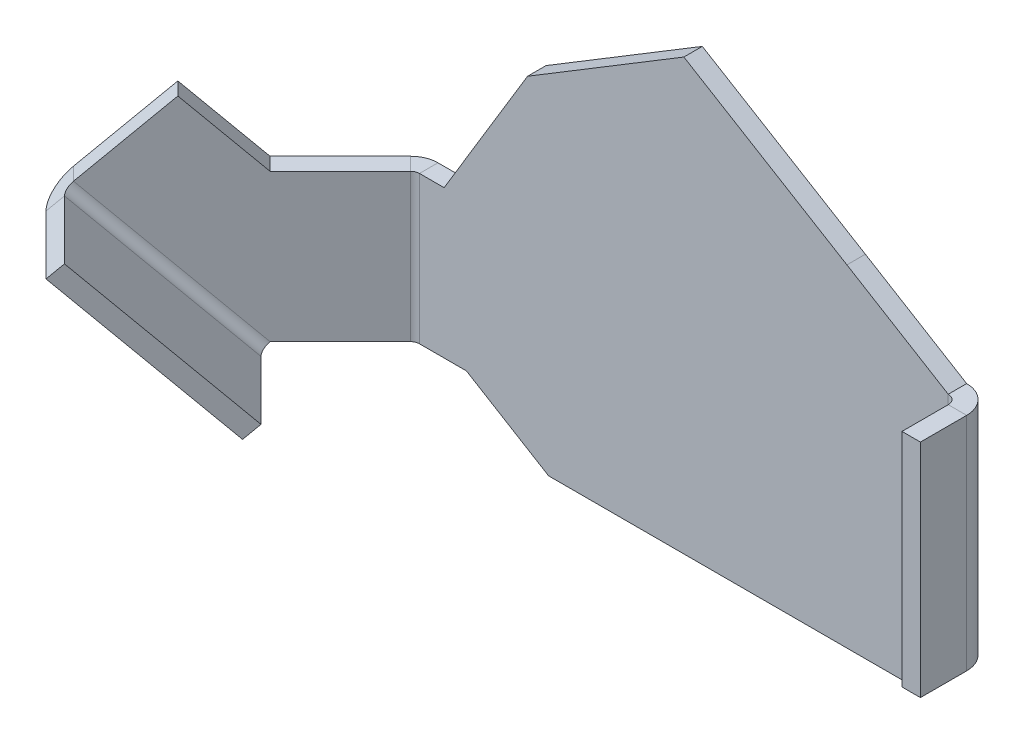
ISO-10303-21;
HEADER;
FILE_DESCRIPTION(('STEP AP214'),'2;1');
FILE_NAME('part.step','',(''),(''),'','','');
FILE_SCHEMA(('AUTOMOTIVE_DESIGN { 1 0 10303 214 1 1 1 1 }'));
ENDSEC;
DATA;
#1=APPLICATION_CONTEXT('core data for automotive mechanical design processes');
#2=APPLICATION_PROTOCOL_DEFINITION('international standard','automotive_design',2000,#1);
#3=PRODUCT_CONTEXT('',#1,'mechanical');
#4=PRODUCT('Part','Part','',(#3));
#5=PRODUCT_RELATED_PRODUCT_CATEGORY('part','',(#4));
#6=PRODUCT_DEFINITION_FORMATION('','',#4);
#7=PRODUCT_DEFINITION_CONTEXT('part definition',#1,'design');
#8=PRODUCT_DEFINITION('design','',#6,#7);
#9=PRODUCT_DEFINITION_SHAPE('','',#8);
#10=(LENGTH_UNIT() NAMED_UNIT(*) SI_UNIT(.MILLI.,.METRE.));
#11=(NAMED_UNIT(*) PLANE_ANGLE_UNIT() SI_UNIT($,.RADIAN.));
#12=(NAMED_UNIT(*) SI_UNIT($,.STERADIAN.) SOLID_ANGLE_UNIT());
#13=UNCERTAINTY_MEASURE_WITH_UNIT(LENGTH_MEASURE(1.E-05),#10,'distance_accuracy_value','');
#14=(GEOMETRIC_REPRESENTATION_CONTEXT(3) GLOBAL_UNCERTAINTY_ASSIGNED_CONTEXT((#13)) GLOBAL_UNIT_ASSIGNED_CONTEXT((#10,
#11,#12)) REPRESENTATION_CONTEXT('',''));
#15=CARTESIAN_POINT('',(0.,0.,0.));
#16=DIRECTION('',(0.,0.,1.));
#17=DIRECTION('',(1.,0.,0.));
#18=AXIS2_PLACEMENT_3D('',#15,#16,#17);
#19=CARTESIAN_POINT('',(-12.1157698818237,0.,-11.8106601717798));
#20=DIRECTION('',(0.707106781186544,0.,0.707106781186551));
#21=DIRECTION('',(0.707106781186551,0.,-0.707106781186544));
#22=AXIS2_PLACEMENT_3D('',#19,#20,#21);
#23=PLANE('',#22);
#24=DIRECTION('',(0.500000000000003,0.707106781186547,-0.499999999999998));
#25=VECTOR('',#24,1.);
#26=CARTESIAN_POINT('',(-23.6904280666929,16.3690385848747,-0.236001986910737));
#27=LINE('',#26,#25);
#28=CARTESIAN_POINT('',(-36.783031771402,-2.14669914110095,12.8566017177982));
#29=VERTEX_POINT('',#28);
#30=CARTESIAN_POINT('',(-32.5403910842827,3.85330085889908,8.6139610306789));
#31=VERTEX_POINT('',#30);
#32=EDGE_CURVE('E323',#29,#31,#27,.T.);
#33=ORIENTED_EDGE('',*,*,#32,.T.);
#34=DIRECTION('',(0.500000000000005,-0.707106781186544,-0.5));
#35=VECTOR('',#34,1.);
#36=CARTESIAN_POINT('',(-28.7903910842826,-1.45,4.86396103067889));
#37=LINE('',#36,#35);
#38=CARTESIAN_POINT('',(-28.7903910842826,-1.45,4.86396103067889));
#39=VERTEX_POINT('',#38);
#40=EDGE_CURVE('E330',#31,#39,#37,.T.);
#41=ORIENTED_EDGE('',*,*,#40,.T.);
#42=DIRECTION('',(0.707106781186551,0.,-0.707106781186544));
#43=VECTOR('',#42,1.);
#44=CARTESIAN_POINT('',(-12.1157698818237,-1.45,-11.8106601717798));
#45=LINE('',#44,#43);
#46=CARTESIAN_POINT('',(-23.0815150268018,-1.45,-0.844915026801835));
#47=VERTEX_POINT('',#46);
#48=EDGE_CURVE('E346',#39,#47,#45,.T.);
#49=ORIENTED_EDGE('',*,*,#48,.T.);
#50=DIRECTION('',(0.,-1.,0.));
#51=VECTOR('',#50,1.);
#52=CARTESIAN_POINT('',(-23.0815150268018,-1.45,-0.844915026801841));
#53=LINE('',#52,#51);
#54=CARTESIAN_POINT('',(-23.0815150268018,-13.45,-0.84491502680184));
#55=VERTEX_POINT('',#54);
#56=EDGE_CURVE('E357',#55,#47,#53,.F.);
#57=ORIENTED_EDGE('',*,*,#56,.F.);
#58=DIRECTION('',(-0.707106781186551,0.,0.707106781186544));
#59=VECTOR('',#58,1.);
#60=CARTESIAN_POINT('',(-12.1157698818237,-13.45,-11.8106601717798));
#61=LINE('',#60,#59);
#62=CARTESIAN_POINT('',(-28.7903910842828,-13.45,4.86396103067896));
#63=VERTEX_POINT('',#62);
#64=EDGE_CURVE('E349',#55,#63,#61,.T.);
#65=ORIENTED_EDGE('',*,*,#64,.T.);
#66=DIRECTION('',(-0.5,0.707106781186552,0.499999999999995));
#67=VECTOR('',#66,1.);
#68=CARTESIAN_POINT('',(-25.2083735865329,-18.5157377259756,1.28194353292918));
#69=LINE('',#68,#67);
#70=EDGE_CURVE('E338',#63,#29,#69,.T.);
#71=ORIENTED_EDGE('',*,*,#70,.T.);
#72=EDGE_LOOP('',(#33,#41,#49,#57,#65,#71));
#73=FACE_BOUND('',#72,.T.);
#74=ADVANCED_FACE('F98',(#73),#23,.F.);
#75=CARTESIAN_POINT('',(-11.0551097100439,0.,-10.75));
#76=DIRECTION('',(0.707106781186544,0.,0.707106781186551));
#77=DIRECTION('',(0.707106781186551,0.,-0.707106781186544));
#78=AXIS2_PLACEMENT_3D('',#75,#76,#77);
#79=PLANE('',#78);
#80=DIRECTION('',(0.500000000000005,-0.707106781186544,-0.5));
#81=VECTOR('',#80,1.);
#82=CARTESIAN_POINT('',(-27.7297309125028,-1.45,5.92462120245872));
#83=LINE('',#82,#81);
#84=CARTESIAN_POINT('',(-31.4797309125028,3.85330085889909,9.67462120245873));
#85=VERTEX_POINT('',#84);
#86=CARTESIAN_POINT('',(-27.7297309125028,-1.45,5.92462120245872));
#87=VERTEX_POINT('',#86);
#88=EDGE_CURVE('E122',#85,#87,#83,.T.);
#89=ORIENTED_EDGE('',*,*,#88,.F.);
#90=DIRECTION('',(0.500000000000003,0.707106781186547,-0.499999999999998));
#91=VECTOR('',#90,1.);
#92=CARTESIAN_POINT('',(-22.6297678949131,16.3690385848747,0.824658184869089));
#93=LINE('',#92,#91);
#94=CARTESIAN_POINT('',(-35.7223715996222,-2.14669914110091,13.917261889578));
#95=VERTEX_POINT('',#94);
#96=EDGE_CURVE('E115',#95,#85,#93,.T.);
#97=ORIENTED_EDGE('',*,*,#96,.F.);
#98=DIRECTION('',(-0.5,0.707106781186552,0.499999999999995));
#99=VECTOR('',#98,1.);
#100=CARTESIAN_POINT('',(-24.1477134147531,-18.5157377259756,2.342603704709));
#101=LINE('',#100,#99);
#102=CARTESIAN_POINT('',(-27.7297309125029,-13.45,5.92462120245879));
#103=VERTEX_POINT('',#102);
#104=EDGE_CURVE('E337',#103,#95,#101,.T.);
#105=ORIENTED_EDGE('',*,*,#104,.F.);
#106=DIRECTION('',(0.707106781186551,0.,-0.707106781186544));
#107=VECTOR('',#106,1.);
#108=CARTESIAN_POINT('',(-36.2150122867414,-13.45,14.4099025766972));
#109=LINE('',#108,#107);
#110=CARTESIAN_POINT('',(-22.020854855022,-13.45,0.215745144977988));
#111=VERTEX_POINT('',#110);
#112=EDGE_CURVE('E354',#111,#103,#109,.F.);
#113=ORIENTED_EDGE('',*,*,#112,.F.);
#114=DIRECTION('',(0.,-1.,0.));
#115=VECTOR('',#114,1.);
#116=CARTESIAN_POINT('',(-22.020854855022,-1.45,0.215745144977987));
#117=LINE('',#116,#115);
#118=CARTESIAN_POINT('',(-22.020854855022,-1.45,0.215745144977988));
#119=VERTEX_POINT('',#118);
#120=EDGE_CURVE('E363',#119,#111,#117,.T.);
#121=ORIENTED_EDGE('',*,*,#120,.F.);
#122=DIRECTION('',(-0.707106781186551,0.,0.707106781186544));
#123=VECTOR('',#122,1.);
#124=CARTESIAN_POINT('',(-21.805109710044,-1.45,0.));
#125=LINE('',#124,#123);
#126=EDGE_CURVE('E352',#87,#119,#125,.F.);
#127=ORIENTED_EDGE('',*,*,#126,.F.);
#128=EDGE_LOOP('',(#89,#97,#105,#113,#121,#127));
#129=FACE_BOUND('',#128,.T.);
#130=ADVANCED_FACE('F558',(#129),#79,.T.);
#131=CARTESIAN_POINT('',(-17.8969405565524,-1.45,15.7574115584093));
#132=DIRECTION('',(0.5,0.707106781186551,-0.499999999999995));
#133=DIRECTION('',(-0.816496580927728,0.577350269189624,0.));
#134=AXIS2_PLACEMENT_3D('',#131,#132,#133);
#135=PLANE('',#134);
#136=ORIENTED_EDGE('',*,*,#40,.F.);
#137=DIRECTION('',(0.707106781186544,0.,0.707106781186551));
#138=VECTOR('',#137,1.);
#139=CARTESIAN_POINT('',(-31.4797309125028,3.85330085889908,9.67462120245872));
#140=LINE('',#139,#138);
#141=EDGE_CURVE('E328',#85,#31,#140,.F.);
#142=ORIENTED_EDGE('',*,*,#141,.F.);
#143=ORIENTED_EDGE('',*,*,#88,.T.);
#144=DIRECTION('',(-0.707106781186544,0.,-0.707106781186551));
#145=VECTOR('',#144,1.);
#146=CARTESIAN_POINT('',(-17.8969405565524,-1.45,15.7574115584093));
#147=LINE('',#146,#145);
#148=EDGE_CURVE('E335',#87,#39,#147,.T.);
#149=ORIENTED_EDGE('',*,*,#148,.T.);
#150=EDGE_LOOP('',(#136,#142,#143,#149));
#151=FACE_BOUND('',#150,.T.);
#152=ADVANCED_FACE('F564',(#151),#135,.T.);
#153=CARTESIAN_POINT('',(-37.2756724585212,-13.45,13.3492424049174));
#154=DIRECTION('',(0.,1.,0.));
#155=DIRECTION('',(-1.,0.,0.));
#156=AXIS2_PLACEMENT_3D('',#153,#154,#155);
#157=PLANE('',#156);
#158=DIRECTION('',(0.707106781186544,0.,0.707106781186551));
#159=VECTOR('',#158,1.);
#160=CARTESIAN_POINT('',(-27.7297309125029,-13.45,5.92462120245881));
#161=LINE('',#160,#159);
#162=EDGE_CURVE('E341',#103,#63,#161,.F.);
#163=ORIENTED_EDGE('',*,*,#162,.T.);
#164=ORIENTED_EDGE('',*,*,#64,.F.);
#165=DIRECTION('',(0.707106781186544,0.,0.707106781186551));
#166=VECTOR('',#165,1.);
#167=CARTESIAN_POINT('',(-22.020854855022,-13.45,0.215745144977986));
#168=LINE('',#167,#166);
#169=EDGE_CURVE('E360',#111,#55,#168,.F.);
#170=ORIENTED_EDGE('',*,*,#169,.F.);
#171=ORIENTED_EDGE('',*,*,#112,.T.);
#172=EDGE_LOOP('',(#163,#164,#170,#171));
#173=FACE_BOUND('',#172,.T.);
#174=ADVANCED_FACE('F576',(#173),#157,.F.);
#175=CARTESIAN_POINT('',(0.,0.,-1.5));
#176=DIRECTION('',(0.,0.,-1.));
#177=DIRECTION('',(-1.,0.,0.));
#178=AXIS2_PLACEMENT_3D('',#175,#176,#177);
#179=PLANE('',#178);
#180=DIRECTION('',(0.,1.,0.));
#181=VECTOR('',#180,1.);
#182=CARTESIAN_POINT('',(21.5,-17.5,-1.5));
#183=LINE('',#182,#181);
#184=CARTESIAN_POINT('',(21.5,-13.5,-1.5));
#185=VERTEX_POINT('',#184);
#186=CARTESIAN_POINT('',(21.5,4.5,-1.5));
#187=VERTEX_POINT('',#186);
#188=EDGE_CURVE('E490',#185,#187,#183,.T.);
#189=ORIENTED_EDGE('',*,*,#188,.F.);
#190=DIRECTION('',(-0.447213595499957,-0.894427190999917,0.));
#191=VECTOR('',#190,1.);
#192=CARTESIAN_POINT('',(22.6,-11.3,-1.5));
#193=LINE('',#192,#191);
#194=CARTESIAN_POINT('',(19.5,-17.5,-1.5));
#195=VERTEX_POINT('',#194);
#196=EDGE_CURVE('E424',#185,#195,#193,.T.);
#197=ORIENTED_EDGE('',*,*,#196,.T.);
#198=DIRECTION('',(1.,0.,0.));
#199=VECTOR('',#198,1.);
#200=CARTESIAN_POINT('',(-21.5,-17.5,-1.5));
#201=LINE('',#200,#199);
#202=CARTESIAN_POINT('',(-11.,-17.5,-1.5));
#203=VERTEX_POINT('',#202);
#204=EDGE_CURVE('E13',#203,#195,#201,.T.);
#205=ORIENTED_EDGE('',*,*,#204,.F.);
#206=DIRECTION('',(-0.855252757747779,0.518211077037938,0.));
#207=VECTOR('',#206,1.);
#208=CARTESIAN_POINT('',(-10.7099953468255,-17.6757183736692,-1.5));
#209=LINE('',#208,#207);
#210=CARTESIAN_POINT('',(-17.6840980873609,-13.45,-1.5));
#211=VERTEX_POINT('',#210);
#212=EDGE_CURVE('E434',#203,#211,#209,.T.);
#213=ORIENTED_EDGE('',*,*,#212,.T.);
#214=DIRECTION('',(-1.,0.,0.));
#215=VECTOR('',#214,1.);
#216=CARTESIAN_POINT('',(0.,-13.45,-1.5));
#217=LINE('',#216,#215);
#218=CARTESIAN_POINT('',(-21.5,-13.45,-1.5));
#219=VERTEX_POINT('',#218);
#220=EDGE_CURVE('E437',#211,#219,#217,.T.);
#221=ORIENTED_EDGE('',*,*,#220,.T.);
#222=DIRECTION('',(0.,-1.,0.));
#223=VECTOR('',#222,1.);
#224=CARTESIAN_POINT('',(-21.5,-17.5,-1.5));
#225=LINE('',#224,#223);
#226=CARTESIAN_POINT('',(-21.5,-1.45,-1.5));
#227=VERTEX_POINT('',#226);
#228=EDGE_CURVE('E107',#227,#219,#225,.T.);
#229=ORIENTED_EDGE('',*,*,#228,.F.);
#230=DIRECTION('',(1.,0.,0.));
#231=VECTOR('',#230,1.);
#232=CARTESIAN_POINT('',(0.,-1.45,-1.5));
#233=LINE('',#232,#231);
#234=CARTESIAN_POINT('',(-19.5,-1.45,-1.5));
#235=VERTEX_POINT('',#234);
#236=EDGE_CURVE('E455',#227,#235,#233,.T.);
#237=ORIENTED_EDGE('',*,*,#236,.T.);
#238=DIRECTION('',(0.516926742783658,0.856029638853164,0.));
#239=VECTOR('',#238,1.);
#240=CARTESIAN_POINT('',(-13.647709791843,8.24138072906628,-1.5));
#241=LINE('',#240,#239);
#242=CARTESIAN_POINT('',(-12.7118908009322,9.7910950822209,-1.5));
#243=VERTEX_POINT('',#242);
#244=EDGE_CURVE('E452',#235,#243,#241,.T.);
#245=ORIENTED_EDGE('',*,*,#244,.T.);
#246=DIRECTION('',(0.855056814722148,0.518534322487156,0.));
#247=VECTOR('',#246,1.);
#248=CARTESIAN_POINT('',(-7.75908535692456,12.7946377370487,-1.5));
#249=LINE('',#248,#247);
#250=CARTESIAN_POINT('',(0.,17.5,-1.5));
#251=VERTEX_POINT('',#250);
#252=EDGE_CURVE('E458',#243,#251,#249,.T.);
#253=ORIENTED_EDGE('',*,*,#252,.T.);
#254=DIRECTION('',(0.856029638853164,-0.516926742783658,0.));
#255=VECTOR('',#254,1.);
#256=CARTESIAN_POINT('',(7.74383072642615,12.8237679954139,-1.5));
#257=LINE('',#256,#255);
#258=CARTESIAN_POINT('',(13.2607683962239,9.49227981982954,-1.5));
#259=VERTEX_POINT('',#258);
#260=EDGE_CURVE('E475',#251,#259,#257,.T.);
#261=ORIENTED_EDGE('',*,*,#260,.T.);
#262=DIRECTION('',(0.855252757747779,-0.518211077037937,0.));
#263=VECTOR('',#262,1.);
#264=CARTESIAN_POINT('',(7.76807502513824,12.8203889920994,-1.5));
#265=LINE('',#264,#263);
#266=EDGE_CURVE('E467',#259,#187,#265,.T.);
#267=ORIENTED_EDGE('',*,*,#266,.T.);
#268=EDGE_LOOP('',(#189,#197,#205,#213,#221,#229,#237,#245,#253,#261,#267));
#269=FACE_BOUND('',#268,.T.);
#270=ADVANCED_FACE('F514',(#269),#179,.T.);
#271=CARTESIAN_POINT('',(0.,0.,0.));
#272=DIRECTION('',(0.,0.,-1.));
#273=DIRECTION('',(-1.,0.,0.));
#274=AXIS2_PLACEMENT_3D('',#271,#272,#273);
#275=PLANE('',#274);
#276=DIRECTION('',(-0.447213595499957,-0.894427190999917,0.));
#277=VECTOR('',#276,1.);
#278=CARTESIAN_POINT('',(22.6,-11.3,0.));
#279=LINE('',#278,#277);
#280=CARTESIAN_POINT('',(21.5,-13.5,0.));
#281=VERTEX_POINT('',#280);
#282=CARTESIAN_POINT('',(19.5,-17.5,0.));
#283=VERTEX_POINT('',#282);
#284=EDGE_CURVE('E423',#281,#283,#279,.T.);
#285=ORIENTED_EDGE('',*,*,#284,.F.);
#286=DIRECTION('',(0.,1.,0.));
#287=VECTOR('',#286,1.);
#288=CARTESIAN_POINT('',(21.5,-17.5,0.));
#289=LINE('',#288,#287);
#290=CARTESIAN_POINT('',(21.5,4.5,0.));
#291=VERTEX_POINT('',#290);
#292=EDGE_CURVE('E487',#281,#291,#289,.T.);
#293=ORIENTED_EDGE('',*,*,#292,.T.);
#294=DIRECTION('',(0.855252757747779,-0.518211077037937,0.));
#295=VECTOR('',#294,1.);
#296=CARTESIAN_POINT('',(7.76807502513824,12.8203889920994,0.));
#297=LINE('',#296,#295);
#298=CARTESIAN_POINT('',(13.2607683962239,9.49227981982954,0.));
#299=VERTEX_POINT('',#298);
#300=EDGE_CURVE('E471',#299,#291,#297,.T.);
#301=ORIENTED_EDGE('',*,*,#300,.F.);
#302=DIRECTION('',(0.856029638853164,-0.516926742783658,0.));
#303=VECTOR('',#302,1.);
#304=CARTESIAN_POINT('',(7.74383072642615,12.8237679954139,0.));
#305=LINE('',#304,#303);
#306=CARTESIAN_POINT('',(0.,17.5,0.));
#307=VERTEX_POINT('',#306);
#308=EDGE_CURVE('E474',#307,#299,#305,.T.);
#309=ORIENTED_EDGE('',*,*,#308,.F.);
#310=DIRECTION('',(0.855056814722148,0.518534322487156,0.));
#311=VECTOR('',#310,1.);
#312=CARTESIAN_POINT('',(-7.75908535692456,12.7946377370487,0.));
#313=LINE('',#312,#311);
#314=CARTESIAN_POINT('',(-12.7118908009322,9.7910950822209,0.));
#315=VERTEX_POINT('',#314);
#316=EDGE_CURVE('E451',#315,#307,#313,.T.);
#317=ORIENTED_EDGE('',*,*,#316,.F.);
#318=DIRECTION('',(0.516926742783658,0.856029638853164,0.));
#319=VECTOR('',#318,1.);
#320=CARTESIAN_POINT('',(-13.647709791843,8.24138072906628,0.));
#321=LINE('',#320,#319);
#322=CARTESIAN_POINT('',(-19.5,-1.45,0.));
#323=VERTEX_POINT('',#322);
#324=EDGE_CURVE('E465',#323,#315,#321,.T.);
#325=ORIENTED_EDGE('',*,*,#324,.F.);
#326=DIRECTION('',(-1.,0.,0.));
#327=VECTOR('',#326,1.);
#328=CARTESIAN_POINT('',(0.,-1.45,0.));
#329=LINE('',#328,#327);
#330=CARTESIAN_POINT('',(-21.5,-1.45,0.));
#331=VERTEX_POINT('',#330);
#332=EDGE_CURVE('E468',#331,#323,#329,.F.);
#333=ORIENTED_EDGE('',*,*,#332,.F.);
#334=DIRECTION('',(0.,-1.,0.));
#335=VECTOR('',#334,1.);
#336=CARTESIAN_POINT('',(-21.5,-17.5,0.));
#337=LINE('',#336,#335);
#338=CARTESIAN_POINT('',(-21.5,-13.45,0.));
#339=VERTEX_POINT('',#338);
#340=EDGE_CURVE('E495',#331,#339,#337,.T.);
#341=ORIENTED_EDGE('',*,*,#340,.T.);
#342=DIRECTION('',(-1.,0.,0.));
#343=VECTOR('',#342,1.);
#344=CARTESIAN_POINT('',(0.,-13.45,0.));
#345=LINE('',#344,#343);
#346=CARTESIAN_POINT('',(-17.6840980873609,-13.45,0.));
#347=VERTEX_POINT('',#346);
#348=EDGE_CURVE('E444',#347,#339,#345,.T.);
#349=ORIENTED_EDGE('',*,*,#348,.F.);
#350=DIRECTION('',(-0.855252757747779,0.518211077037938,0.));
#351=VECTOR('',#350,1.);
#352=CARTESIAN_POINT('',(-10.7099953468255,-17.6757183736692,0.));
#353=LINE('',#352,#351);
#354=CARTESIAN_POINT('',(-11.,-17.5,0.));
#355=VERTEX_POINT('',#354);
#356=EDGE_CURVE('E433',#355,#347,#353,.T.);
#357=ORIENTED_EDGE('',*,*,#356,.F.);
#358=DIRECTION('',(1.,0.,0.));
#359=VECTOR('',#358,1.);
#360=CARTESIAN_POINT('',(-21.5,-17.5,0.));
#361=LINE('',#360,#359);
#362=EDGE_CURVE('E102',#355,#283,#361,.T.);
#363=ORIENTED_EDGE('',*,*,#362,.T.);
#364=EDGE_LOOP('',(#285,#293,#301,#309,#317,#325,#333,#341,#349,#357,#363));
#365=FACE_BOUND('',#364,.T.);
#366=ADVANCED_FACE('F505',(#365),#275,.F.);
#367=CARTESIAN_POINT('',(-21.5,-17.5,-1.5));
#368=DIRECTION('',(0.,-1.,0.));
#369=DIRECTION('',(0.,0.,-1.));
#370=AXIS2_PLACEMENT_3D('',#367,#368,#369);
#371=PLANE('',#370);
#372=ORIENTED_EDGE('',*,*,#204,.T.);
#373=DIRECTION('',(0.,0.,-1.));
#374=VECTOR('',#373,1.);
#375=CARTESIAN_POINT('',(19.5,-17.5,-1.5));
#376=LINE('',#375,#374);
#377=EDGE_CURVE('E412',#195,#283,#376,.F.);
#378=ORIENTED_EDGE('',*,*,#377,.T.);
#379=ORIENTED_EDGE('',*,*,#362,.F.);
#380=DIRECTION('',(0.,0.,-1.));
#381=VECTOR('',#380,1.);
#382=CARTESIAN_POINT('',(-11.,-17.5,-1.5));
#383=LINE('',#382,#381);
#384=EDGE_CURVE('E431',#203,#355,#383,.F.);
#385=ORIENTED_EDGE('',*,*,#384,.F.);
#386=EDGE_LOOP('',(#372,#378,#379,#385));
#387=FACE_BOUND('',#386,.T.);
#388=ADVANCED_FACE('F100',(#387),#371,.T.);
#389=CARTESIAN_POINT('',(7.76807502513824,12.8203889920994,-1.5));
#390=DIRECTION('',(0.518211077037937,0.855252757747779,0.));
#391=DIRECTION('',(0.855252757747779,-0.518211077037937,0.));
#392=AXIS2_PLACEMENT_3D('',#389,#390,#391);
#393=PLANE('',#392);
#394=DIRECTION('',(0.,0.,-1.));
#395=VECTOR('',#394,1.);
#396=CARTESIAN_POINT('',(21.5,4.5,-1.5));
#397=LINE('',#396,#395);
#398=EDGE_CURVE('E481',#187,#291,#397,.F.);
#399=ORIENTED_EDGE('',*,*,#398,.F.);
#400=ORIENTED_EDGE('',*,*,#266,.F.);
#401=DIRECTION('',(0.,0.,-1.));
#402=VECTOR('',#401,1.);
#403=CARTESIAN_POINT('',(13.2607683962239,9.49227981982954,-1.5));
#404=LINE('',#403,#402);
#405=EDGE_CURVE('E477',#259,#299,#404,.F.);
#406=ORIENTED_EDGE('',*,*,#405,.T.);
#407=ORIENTED_EDGE('',*,*,#300,.T.);
#408=EDGE_LOOP('',(#399,#400,#406,#407));
#409=FACE_BOUND('',#408,.T.);
#410=ADVANCED_FACE('F906',(#409),#393,.T.);
#411=CARTESIAN_POINT('',(7.74383072642615,12.8237679954139,-1.5));
#412=DIRECTION('',(0.516926742783658,0.856029638853164,0.));
#413=DIRECTION('',(0.856029638853164,-0.516926742783658,0.));
#414=AXIS2_PLACEMENT_3D('',#411,#412,#413);
#415=PLANE('',#414);
#416=ORIENTED_EDGE('',*,*,#260,.F.);
#417=DIRECTION('',(0.,0.,-1.));
#418=VECTOR('',#417,1.);
#419=CARTESIAN_POINT('',(0.,17.5,-1.5));
#420=LINE('',#419,#418);
#421=EDGE_CURVE('E484',#251,#307,#420,.F.);
#422=ORIENTED_EDGE('',*,*,#421,.T.);
#423=ORIENTED_EDGE('',*,*,#308,.T.);
#424=ORIENTED_EDGE('',*,*,#405,.F.);
#425=EDGE_LOOP('',(#416,#422,#423,#424));
#426=FACE_BOUND('',#425,.T.);
#427=ADVANCED_FACE('F896',(#426),#415,.T.);
#428=CARTESIAN_POINT('',(0.,-1.45,-1.5));
#429=DIRECTION('',(0.,1.,0.));
#430=DIRECTION('',(1.,0.,0.));
#431=AXIS2_PLACEMENT_3D('',#428,#429,#430);
#432=PLANE('',#431);
#433=DIRECTION('',(0.,0.,-1.));
#434=VECTOR('',#433,1.);
#435=CARTESIAN_POINT('',(-19.5,-1.45,-1.5));
#436=LINE('',#435,#434);
#437=EDGE_CURVE('E446',#235,#323,#436,.F.);
#438=ORIENTED_EDGE('',*,*,#437,.F.);
#439=ORIENTED_EDGE('',*,*,#236,.F.);
#440=DIRECTION('',(0.,0.,-1.));
#441=VECTOR('',#440,1.);
#442=CARTESIAN_POINT('',(-21.5,-1.45,-1.5));
#443=LINE('',#442,#441);
#444=EDGE_CURVE('E456',#227,#331,#443,.F.);
#445=ORIENTED_EDGE('',*,*,#444,.T.);
#446=ORIENTED_EDGE('',*,*,#332,.T.);
#447=EDGE_LOOP('',(#438,#439,#445,#446));
#448=FACE_BOUND('',#447,.T.);
#449=ADVANCED_FACE('F886',(#448),#432,.T.);
#450=CARTESIAN_POINT('',(-7.75908535692456,12.7946377370487,-1.5));
#451=DIRECTION('',(-0.518534322487156,0.855056814722148,0.));
#452=DIRECTION('',(0.855056814722148,0.518534322487156,0.));
#453=AXIS2_PLACEMENT_3D('',#450,#451,#452);
#454=PLANE('',#453);
#455=ORIENTED_EDGE('',*,*,#421,.F.);
#456=ORIENTED_EDGE('',*,*,#252,.F.);
#457=DIRECTION('',(0.,0.,-1.));
#458=VECTOR('',#457,1.);
#459=CARTESIAN_POINT('',(-12.7118908009322,9.7910950822209,-1.5));
#460=LINE('',#459,#458);
#461=EDGE_CURVE('E448',#243,#315,#460,.F.);
#462=ORIENTED_EDGE('',*,*,#461,.T.);
#463=ORIENTED_EDGE('',*,*,#316,.T.);
#464=EDGE_LOOP('',(#455,#456,#462,#463));
#465=FACE_BOUND('',#464,.T.);
#466=ADVANCED_FACE('F876',(#465),#454,.T.);
#467=CARTESIAN_POINT('',(-13.647709791843,8.24138072906628,-1.5));
#468=DIRECTION('',(-0.856029638853164,0.516926742783658,0.));
#469=DIRECTION('',(0.516926742783658,0.856029638853164,0.));
#470=AXIS2_PLACEMENT_3D('',#467,#468,#469);
#471=PLANE('',#470);
#472=ORIENTED_EDGE('',*,*,#244,.F.);
#473=ORIENTED_EDGE('',*,*,#437,.T.);
#474=ORIENTED_EDGE('',*,*,#324,.T.);
#475=ORIENTED_EDGE('',*,*,#461,.F.);
#476=EDGE_LOOP('',(#472,#473,#474,#475));
#477=FACE_BOUND('',#476,.T.);
#478=ADVANCED_FACE('F866',(#477),#471,.T.);
#479=CARTESIAN_POINT('',(0.,-13.45,-1.5));
#480=DIRECTION('',(0.,-1.,0.));
#481=DIRECTION('',(-1.,0.,0.));
#482=AXIS2_PLACEMENT_3D('',#479,#480,#481);
#483=PLANE('',#482);
#484=DIRECTION('',(0.,0.,-1.));
#485=VECTOR('',#484,1.);
#486=CARTESIAN_POINT('',(-21.5,-13.45,-1.5));
#487=LINE('',#486,#485);
#488=EDGE_CURVE('E430',#219,#339,#487,.F.);
#489=ORIENTED_EDGE('',*,*,#488,.F.);
#490=ORIENTED_EDGE('',*,*,#220,.F.);
#491=DIRECTION('',(0.,0.,-1.));
#492=VECTOR('',#491,1.);
#493=CARTESIAN_POINT('',(-17.6840980873609,-13.45,-1.5));
#494=LINE('',#493,#492);
#495=EDGE_CURVE('E438',#211,#347,#494,.F.);
#496=ORIENTED_EDGE('',*,*,#495,.T.);
#497=ORIENTED_EDGE('',*,*,#348,.T.);
#498=EDGE_LOOP('',(#489,#490,#496,#497));
#499=FACE_BOUND('',#498,.T.);
#500=ADVANCED_FACE('F856',(#499),#483,.T.);
#501=CARTESIAN_POINT('',(-10.7099953468255,-17.6757183736692,-1.5));
#502=DIRECTION('',(-0.518211077037938,-0.855252757747779,0.));
#503=DIRECTION('',(-0.855252757747779,0.518211077037938,0.));
#504=AXIS2_PLACEMENT_3D('',#501,#502,#503);
#505=PLANE('',#504);
#506=ORIENTED_EDGE('',*,*,#495,.F.);
#507=ORIENTED_EDGE('',*,*,#212,.F.);
#508=ORIENTED_EDGE('',*,*,#384,.T.);
#509=ORIENTED_EDGE('',*,*,#356,.T.);
#510=EDGE_LOOP('',(#506,#507,#508,#509));
#511=FACE_BOUND('',#510,.T.);
#512=ADVANCED_FACE('F847',(#511),#505,.T.);
#513=CARTESIAN_POINT('',(22.6,-11.3,-1.5));
#514=DIRECTION('',(0.894427190999916,-0.447213595499957,0.));
#515=DIRECTION('',(-0.447213595499957,-0.894427190999917,0.));
#516=AXIS2_PLACEMENT_3D('',#513,#514,#515);
#517=PLANE('',#516);
#518=ORIENTED_EDGE('',*,*,#377,.F.);
#519=ORIENTED_EDGE('',*,*,#196,.F.);
#520=DIRECTION('',(0.,0.,-1.));
#521=VECTOR('',#520,1.);
#522=CARTESIAN_POINT('',(21.5,-13.5,-1.5));
#523=LINE('',#522,#521);
#524=EDGE_CURVE('E421',#185,#281,#523,.F.);
#525=ORIENTED_EDGE('',*,*,#524,.T.);
#526=ORIENTED_EDGE('',*,*,#284,.T.);
#527=EDGE_LOOP('',(#518,#519,#525,#526));
#528=FACE_BOUND('',#527,.T.);
#529=ADVANCED_FACE('F511',(#528),#517,.T.);
#530=CARTESIAN_POINT('',(21.5,-13.5,0.736599999999999));
#531=DIRECTION('',(0.,-1.,0.));
#532=DIRECTION('',(0.,0.,-1.));
#533=AXIS2_PLACEMENT_3D('',#530,#531,#532);
#534=PLANE('',#533);
#535=DIRECTION('',(-1.,0.,0.));
#536=VECTOR('',#535,1.);
#537=CARTESIAN_POINT('',(23.7366,-13.5,0.736599999999992));
#538=LINE('',#537,#536);
#539=CARTESIAN_POINT('',(22.2366,-13.5,0.736599999999997));
#540=VERTEX_POINT('',#539);
#541=CARTESIAN_POINT('',(23.7366,-13.5,0.736599999999992));
#542=VERTEX_POINT('',#541);
#543=EDGE_CURVE('E370',#540,#542,#538,.F.);
#544=ORIENTED_EDGE('',*,*,#543,.F.);
#545=CARTESIAN_POINT('',(21.5,-13.5,0.736599999999999));
#546=DIRECTION('',(0.,1.,0.));
#547=DIRECTION('',(0.,0.,1.));
#548=AXIS2_PLACEMENT_3D('',#545,#546,#547);
#549=CIRCLE('',#548,0.736599999999997);
#550=EDGE_CURVE('E416',#281,#540,#549,.F.);
#551=ORIENTED_EDGE('',*,*,#550,.F.);
#552=ORIENTED_EDGE('',*,*,#524,.F.);
#553=CARTESIAN_POINT('',(21.5,-13.5,0.736599999999999));
#554=DIRECTION('',(0.,1.,0.));
#555=DIRECTION('',(0.,0.,1.));
#556=AXIS2_PLACEMENT_3D('',#553,#554,#555);
#557=CIRCLE('',#556,2.2366);
#558=EDGE_CURVE('E409',#185,#542,#557,.F.);
#559=ORIENTED_EDGE('',*,*,#558,.T.);
#560=EDGE_LOOP('',(#544,#551,#552,#559));
#561=FACE_BOUND('',#560,.T.);
#562=ADVANCED_FACE('F521',(#561),#534,.T.);
#563=CARTESIAN_POINT('',(21.5,4.5,0.736599999999999));
#564=DIRECTION('',(0.,-1.,0.));
#565=DIRECTION('',(0.,0.,-1.));
#566=AXIS2_PLACEMENT_3D('',#563,#564,#565);
#567=PLANE('',#566);
#568=CARTESIAN_POINT('',(21.5,4.5,0.736599999999999));
#569=DIRECTION('',(0.,1.,0.));
#570=DIRECTION('',(0.,0.,1.));
#571=AXIS2_PLACEMENT_3D('',#568,#569,#570);
#572=CIRCLE('',#571,0.736599999999997);
#573=CARTESIAN_POINT('',(22.2366,4.5,0.736599999999997));
#574=VERTEX_POINT('',#573);
#575=EDGE_CURVE('E382',#574,#291,#572,.T.);
#576=ORIENTED_EDGE('',*,*,#575,.F.);
#577=DIRECTION('',(-1.,0.,0.));
#578=VECTOR('',#577,1.);
#579=CARTESIAN_POINT('',(22.2366,4.5,0.736599999999997));
#580=LINE('',#579,#578);
#581=CARTESIAN_POINT('',(23.7366,4.5,0.736599999999992));
#582=VERTEX_POINT('',#581);
#583=EDGE_CURVE('E402',#574,#582,#580,.F.);
#584=ORIENTED_EDGE('',*,*,#583,.T.);
#585=CARTESIAN_POINT('',(21.5,4.5,0.736599999999999));
#586=DIRECTION('',(0.,1.,0.));
#587=DIRECTION('',(0.,0.,1.));
#588=AXIS2_PLACEMENT_3D('',#585,#586,#587);
#589=CIRCLE('',#588,2.2366);
#590=EDGE_CURVE('E413',#582,#187,#589,.T.);
#591=ORIENTED_EDGE('',*,*,#590,.T.);
#592=ORIENTED_EDGE('',*,*,#398,.T.);
#593=EDGE_LOOP('',(#576,#584,#591,#592));
#594=FACE_BOUND('',#593,.T.);
#595=ADVANCED_FACE('F821',(#594),#567,.F.);
#596=CARTESIAN_POINT('',(21.5,4.5,0.736599999999999));
#597=DIRECTION('',(0.,1.,0.));
#598=DIRECTION('',(1.,0.,0.));
#599=AXIS2_PLACEMENT_3D('',#596,#597,#598);
#600=CYLINDRICAL_SURFACE('',#599,2.2366);
#601=ORIENTED_EDGE('',*,*,#188,.T.);
#602=ORIENTED_EDGE('',*,*,#590,.F.);
#603=DIRECTION('',(0.,1.,0.));
#604=VECTOR('',#603,1.);
#605=CARTESIAN_POINT('',(23.7366,-13.5,0.736599999999992));
#606=LINE('',#605,#604);
#607=EDGE_CURVE('E400',#582,#542,#606,.F.);
#608=ORIENTED_EDGE('',*,*,#607,.T.);
#609=ORIENTED_EDGE('',*,*,#558,.F.);
#610=EDGE_LOOP('',(#601,#602,#608,#609));
#611=FACE_BOUND('',#610,.T.);
#612=ADVANCED_FACE('F522',(#611),#600,.T.);
#613=CARTESIAN_POINT('',(21.5,4.5,0.736599999999999));
#614=DIRECTION('',(0.,1.,0.));
#615=DIRECTION('',(1.,0.,0.));
#616=AXIS2_PLACEMENT_3D('',#613,#614,#615);
#617=CYLINDRICAL_SURFACE('',#616,0.736599999999997);
#618=ORIENTED_EDGE('',*,*,#292,.F.);
#619=ORIENTED_EDGE('',*,*,#550,.T.);
#620=DIRECTION('',(0.,1.,0.));
#621=VECTOR('',#620,1.);
#622=CARTESIAN_POINT('',(22.2366,-13.5,0.736599999999997));
#623=LINE('',#622,#621);
#624=EDGE_CURVE('E405',#540,#574,#623,.T.);
#625=ORIENTED_EDGE('',*,*,#624,.T.);
#626=ORIENTED_EDGE('',*,*,#575,.T.);
#627=EDGE_LOOP('',(#618,#619,#625,#626));
#628=FACE_BOUND('',#627,.T.);
#629=ADVANCED_FACE('F543',(#628),#617,.F.);
#630=CARTESIAN_POINT('',(23.7366,4.5,4.5));
#631=DIRECTION('',(0.,-1.,0.));
#632=DIRECTION('',(0.,0.,-1.));
#633=AXIS2_PLACEMENT_3D('',#630,#631,#632);
#634=PLANE('',#633);
#635=ORIENTED_EDGE('',*,*,#583,.F.);
#636=DIRECTION('',(0.,0.,-1.));
#637=VECTOR('',#636,1.);
#638=CARTESIAN_POINT('',(22.2366,4.5,4.5));
#639=LINE('',#638,#637);
#640=CARTESIAN_POINT('',(22.2366,4.5,4.50000000000001));
#641=VERTEX_POINT('',#640);
#642=EDGE_CURVE('E398',#574,#641,#639,.F.);
#643=ORIENTED_EDGE('',*,*,#642,.T.);
#644=DIRECTION('',(-1.,0.,0.));
#645=VECTOR('',#644,1.);
#646=CARTESIAN_POINT('',(23.7366,4.5,4.5));
#647=LINE('',#646,#645);
#648=CARTESIAN_POINT('',(23.7366,4.5,4.5));
#649=VERTEX_POINT('',#648);
#650=EDGE_CURVE('E379',#649,#641,#647,.T.);
#651=ORIENTED_EDGE('',*,*,#650,.F.);
#652=DIRECTION('',(0.,0.,1.));
#653=VECTOR('',#652,1.);
#654=CARTESIAN_POINT('',(23.7366,4.5,0.));
#655=LINE('',#654,#653);
#656=EDGE_CURVE('E391',#582,#649,#655,.T.);
#657=ORIENTED_EDGE('',*,*,#656,.F.);
#658=EDGE_LOOP('',(#635,#643,#651,#657));
#659=FACE_BOUND('',#658,.T.);
#660=ADVANCED_FACE('F531',(#659),#634,.F.);
#661=CARTESIAN_POINT('',(23.7366,-13.5,0.));
#662=DIRECTION('',(0.,1.,0.));
#663=DIRECTION('',(0.,0.,1.));
#664=AXIS2_PLACEMENT_3D('',#661,#662,#663);
#665=PLANE('',#664);
#666=ORIENTED_EDGE('',*,*,#543,.T.);
#667=DIRECTION('',(0.,0.,-1.));
#668=VECTOR('',#667,1.);
#669=CARTESIAN_POINT('',(23.7366,-13.5,0.));
#670=LINE('',#669,#668);
#671=CARTESIAN_POINT('',(23.7366,-13.5,4.5));
#672=VERTEX_POINT('',#671);
#673=EDGE_CURVE('E386',#672,#542,#670,.T.);
#674=ORIENTED_EDGE('',*,*,#673,.F.);
#675=DIRECTION('',(-1.,0.,0.));
#676=VECTOR('',#675,1.);
#677=CARTESIAN_POINT('',(23.7366,-13.5,4.5));
#678=LINE('',#677,#676);
#679=CARTESIAN_POINT('',(22.2366,-13.5,4.50000000000001));
#680=VERTEX_POINT('',#679);
#681=EDGE_CURVE('E383',#672,#680,#678,.T.);
#682=ORIENTED_EDGE('',*,*,#681,.T.);
#683=DIRECTION('',(0.,0.,1.));
#684=VECTOR('',#683,1.);
#685=CARTESIAN_POINT('',(22.2366,-13.5,0.));
#686=LINE('',#685,#684);
#687=EDGE_CURVE('E393',#680,#540,#686,.F.);
#688=ORIENTED_EDGE('',*,*,#687,.T.);
#689=EDGE_LOOP('',(#666,#674,#682,#688));
#690=FACE_BOUND('',#689,.T.);
#691=ADVANCED_FACE('F540',(#690),#665,.F.);
#692=CARTESIAN_POINT('',(23.7366,0.,0.));
#693=DIRECTION('',(-1.,0.,0.));
#694=DIRECTION('',(0.,0.,1.));
#695=AXIS2_PLACEMENT_3D('',#692,#693,#694);
#696=PLANE('',#695);
#697=ORIENTED_EDGE('',*,*,#607,.F.);
#698=ORIENTED_EDGE('',*,*,#656,.T.);
#699=DIRECTION('',(0.,-1.,0.));
#700=VECTOR('',#699,1.);
#701=CARTESIAN_POINT('',(23.7366,0.,4.5));
#702=LINE('',#701,#700);
#703=EDGE_CURVE('E389',#649,#672,#702,.T.);
#704=ORIENTED_EDGE('',*,*,#703,.T.);
#705=ORIENTED_EDGE('',*,*,#673,.T.);
#706=EDGE_LOOP('',(#697,#698,#704,#705));
#707=FACE_BOUND('',#706,.T.);
#708=ADVANCED_FACE('F526',(#707),#696,.F.);
#709=CARTESIAN_POINT('',(22.2366,0.,0.));
#710=DIRECTION('',(-1.,0.,0.));
#711=DIRECTION('',(0.,0.,1.));
#712=AXIS2_PLACEMENT_3D('',#709,#710,#711);
#713=PLANE('',#712);
#714=ORIENTED_EDGE('',*,*,#642,.F.);
#715=ORIENTED_EDGE('',*,*,#624,.F.);
#716=ORIENTED_EDGE('',*,*,#687,.F.);
#717=DIRECTION('',(0.,1.,0.));
#718=VECTOR('',#717,1.);
#719=CARTESIAN_POINT('',(22.2366,-13.5,4.50000000000001));
#720=LINE('',#719,#718);
#721=EDGE_CURVE('E396',#641,#680,#720,.F.);
#722=ORIENTED_EDGE('',*,*,#721,.F.);
#723=EDGE_LOOP('',(#714,#715,#716,#722));
#724=FACE_BOUND('',#723,.T.);
#725=ADVANCED_FACE('F546',(#724),#713,.T.);
#726=CARTESIAN_POINT('',(23.7366,-13.5,4.5));
#727=DIRECTION('',(0.,0.,-1.));
#728=DIRECTION('',(-1.,0.,0.));
#729=AXIS2_PLACEMENT_3D('',#726,#727,#728);
#730=PLANE('',#729);
#731=ORIENTED_EDGE('',*,*,#721,.T.);
#732=ORIENTED_EDGE('',*,*,#681,.F.);
#733=ORIENTED_EDGE('',*,*,#703,.F.);
#734=ORIENTED_EDGE('',*,*,#650,.T.);
#735=EDGE_LOOP('',(#731,#732,#733,#734));
#736=FACE_BOUND('',#735,.T.);
#737=ADVANCED_FACE('F537',(#736),#730,.F.);
#738=CARTESIAN_POINT('',(-21.5,-1.45,0.736600000000001));
#739=DIRECTION('',(0.,1.,0.));
#740=DIRECTION('',(0.,0.,1.));
#741=AXIS2_PLACEMENT_3D('',#738,#739,#740);
#742=PLANE('',#741);
#743=DIRECTION('',(0.707106781186544,0.,0.707106781186551));
#744=VECTOR('',#743,1.);
#745=CARTESIAN_POINT('',(-23.0815150268018,-1.45,-0.84491502680184));
#746=LINE('',#745,#744);
#747=EDGE_CURVE('E345',#119,#47,#746,.F.);
#748=ORIENTED_EDGE('',*,*,#747,.F.);
#749=CARTESIAN_POINT('',(-21.5,-1.45,0.736600000000001));
#750=DIRECTION('',(0.,-1.,0.));
#751=DIRECTION('',(0.,0.,-1.));
#752=AXIS2_PLACEMENT_3D('',#749,#750,#751);
#753=CIRCLE('',#752,0.736599999999999);
#754=EDGE_CURVE('E374',#331,#119,#753,.F.);
#755=ORIENTED_EDGE('',*,*,#754,.F.);
#756=ORIENTED_EDGE('',*,*,#444,.F.);
#757=CARTESIAN_POINT('',(-21.5,-1.45,0.736600000000001));
#758=DIRECTION('',(0.,-1.,0.));
#759=DIRECTION('',(0.,0.,-1.));
#760=AXIS2_PLACEMENT_3D('',#757,#758,#759);
#761=CIRCLE('',#760,2.2366);
#762=EDGE_CURVE('E367',#227,#47,#761,.F.);
#763=ORIENTED_EDGE('',*,*,#762,.T.);
#764=EDGE_LOOP('',(#748,#755,#756,#763));
#765=FACE_BOUND('',#764,.T.);
#766=ADVANCED_FACE('F553',(#765),#742,.T.);
#767=CARTESIAN_POINT('',(-21.5,-13.45,0.736600000000001));
#768=DIRECTION('',(0.,1.,0.));
#769=DIRECTION('',(0.,0.,1.));
#770=AXIS2_PLACEMENT_3D('',#767,#768,#769);
#771=PLANE('',#770);
#772=CARTESIAN_POINT('',(-21.5,-13.45,0.736600000000001));
#773=DIRECTION('',(0.,-1.,0.));
#774=DIRECTION('',(0.,0.,-1.));
#775=AXIS2_PLACEMENT_3D('',#772,#773,#774);
#776=CIRCLE('',#775,0.736599999999999);
#777=EDGE_CURVE('E348',#111,#339,#776,.T.);
#778=ORIENTED_EDGE('',*,*,#777,.F.);
#779=ORIENTED_EDGE('',*,*,#169,.T.);
#780=CARTESIAN_POINT('',(-21.5,-13.45,0.736600000000001));
#781=DIRECTION('',(0.,-1.,0.));
#782=DIRECTION('',(0.,0.,-1.));
#783=AXIS2_PLACEMENT_3D('',#780,#781,#782);
#784=CIRCLE('',#783,2.2366);
#785=EDGE_CURVE('E371',#55,#219,#784,.T.);
#786=ORIENTED_EDGE('',*,*,#785,.T.);
#787=ORIENTED_EDGE('',*,*,#488,.T.);
#788=EDGE_LOOP('',(#778,#779,#786,#787));
#789=FACE_BOUND('',#788,.T.);
#790=ADVANCED_FACE('F583',(#789),#771,.F.);
#791=CARTESIAN_POINT('',(-21.5,-13.45,0.736600000000001));
#792=DIRECTION('',(0.,-1.,0.));
#793=DIRECTION('',(-0.707106781186544,0.,-0.707106781186551));
#794=AXIS2_PLACEMENT_3D('',#791,#792,#793);
#795=CYLINDRICAL_SURFACE('',#794,2.2366);
#796=ORIENTED_EDGE('',*,*,#228,.T.);
#797=ORIENTED_EDGE('',*,*,#785,.F.);
#798=ORIENTED_EDGE('',*,*,#56,.T.);
#799=ORIENTED_EDGE('',*,*,#762,.F.);
#800=EDGE_LOOP('',(#796,#797,#798,#799));
#801=FACE_BOUND('',#800,.T.);
#802=ADVANCED_FACE('F580',(#801),#795,.T.);
#803=CARTESIAN_POINT('',(-21.5,-13.45,0.736600000000001));
#804=DIRECTION('',(0.,-1.,0.));
#805=DIRECTION('',(-0.707106781186544,0.,-0.707106781186551));
#806=AXIS2_PLACEMENT_3D('',#803,#804,#805);
#807=CYLINDRICAL_SURFACE('',#806,0.736599999999999);
#808=ORIENTED_EDGE('',*,*,#340,.F.);
#809=ORIENTED_EDGE('',*,*,#754,.T.);
#810=ORIENTED_EDGE('',*,*,#120,.T.);
#811=ORIENTED_EDGE('',*,*,#777,.T.);
#812=EDGE_LOOP('',(#808,#809,#810,#811));
#813=FACE_BOUND('',#812,.T.);
#814=ADVANCED_FACE('F574',(#813),#807,.F.);
#815=CARTESIAN_POINT('',(-22.8657698818238,-1.45,-1.06066017177983));
#816=DIRECTION('',(0.,-1.,0.));
#817=DIRECTION('',(1.,0.,0.));
#818=AXIS2_PLACEMENT_3D('',#815,#816,#817);
#819=PLANE('',#818);
#820=ORIENTED_EDGE('',*,*,#48,.F.);
#821=ORIENTED_EDGE('',*,*,#148,.F.);
#822=ORIENTED_EDGE('',*,*,#126,.T.);
#823=ORIENTED_EDGE('',*,*,#747,.T.);
#824=EDGE_LOOP('',(#820,#821,#822,#823));
#825=FACE_BOUND('',#824,.T.);
#826=ADVANCED_FACE('F570',(#825),#819,.F.);
#827=CARTESIAN_POINT('',(-22.6297678949131,16.3690385848747,0.824658184869089));
#828=DIRECTION('',(0.500000000000003,-0.707106781186548,-0.499999999999997));
#829=DIRECTION('',(0.500000000000003,0.707106781186547,-0.499999999999998));
#830=AXIS2_PLACEMENT_3D('',#827,#828,#829);
#831=PLANE('',#830);
#832=ORIENTED_EDGE('',*,*,#96,.T.);
#833=ORIENTED_EDGE('',*,*,#141,.T.);
#834=ORIENTED_EDGE('',*,*,#32,.F.);
#835=DIRECTION('',(0.707106781186544,0.,0.707106781186551));
#836=VECTOR('',#835,1.);
#837=CARTESIAN_POINT('',(-35.7223715996222,-2.14669914110095,13.917261889578));
#838=LINE('',#837,#836);
#839=EDGE_CURVE('E326',#95,#29,#838,.F.);
#840=ORIENTED_EDGE('',*,*,#839,.F.);
#841=EDGE_LOOP('',(#832,#833,#834,#840));
#842=FACE_BOUND('',#841,.T.);
#843=ADVANCED_FACE('F573',(#842),#831,.F.);
#844=CARTESIAN_POINT('',(-35.2015167446001,-2.14669914110091,14.4381167446));
#845=DIRECTION('',(-0.5,0.707106781186552,0.499999999999995));
#846=DIRECTION('',(-0.816496580927728,-0.577350269189623,0.));
#847=AXIS2_PLACEMENT_3D('',#844,#845,#846);
#848=PLANE('',#847);
#849=DIRECTION('',(0.500000000000005,0.707106781186547,-0.499999999999995));
#850=VECTOR('',#849,1.);
#851=CARTESIAN_POINT('',(-36.3198167446002,-3.72821416790278,15.5564167446));
#852=LINE('',#851,#850);
#853=CARTESIAN_POINT('',(-35.5698167446002,-2.66755399612296,14.8064167446));
#854=VERTEX_POINT('',#853);
#855=CARTESIAN_POINT('',(-36.3198167446002,-3.72821416790278,15.5564167446));
#856=VERTEX_POINT('',#855);
#857=EDGE_CURVE('E293',#854,#856,#852,.F.);
#858=ORIENTED_EDGE('',*,*,#857,.F.);
#859=CARTESIAN_POINT('',(-35.2015167446001,-2.14669914110091,14.4381167446));
#860=DIRECTION('',(0.5,-0.707106781186552,-0.499999999999995));
#861=DIRECTION('',(0.816496580927728,0.577350269189623,0.));
#862=AXIS2_PLACEMENT_3D('',#859,#860,#861);
#863=CIRCLE('',#862,0.736600000000051);
#864=EDGE_CURVE('E317',#95,#854,#863,.F.);
#865=ORIENTED_EDGE('',*,*,#864,.F.);
#866=ORIENTED_EDGE('',*,*,#839,.T.);
#867=CARTESIAN_POINT('',(-35.2015167446001,-2.14669914110091,14.4381167446));
#868=DIRECTION('',(0.5,-0.707106781186552,-0.499999999999995));
#869=DIRECTION('',(0.816496580927728,0.577350269189623,0.));
#870=AXIS2_PLACEMENT_3D('',#867,#868,#869);
#871=CIRCLE('',#870,2.23660000000005);
#872=EDGE_CURVE('E311',#29,#856,#871,.F.);
#873=ORIENTED_EDGE('',*,*,#872,.T.);
#874=EDGE_LOOP('',(#858,#865,#866,#873));
#875=FACE_BOUND('',#874,.T.);
#876=ADVANCED_FACE('F610',(#875),#848,.T.);
#877=CARTESIAN_POINT('',(-27.2088760574809,-13.45,6.44547605748084));
#878=DIRECTION('',(-0.5,0.707106781186552,0.499999999999995));
#879=DIRECTION('',(-0.816496580927728,-0.577350269189623,0.));
#880=AXIS2_PLACEMENT_3D('',#877,#878,#879);
#881=PLANE('',#880);
#882=CARTESIAN_POINT('',(-27.2088760574809,-13.45,6.44547605748084));
#883=DIRECTION('',(0.5,-0.707106781186552,-0.499999999999995));
#884=DIRECTION('',(0.816496580927728,0.577350269189623,0.));
#885=AXIS2_PLACEMENT_3D('',#882,#883,#884);
#886=CIRCLE('',#885,0.736600000000051);
#887=CARTESIAN_POINT('',(-27.5771760574809,-13.9708548550221,6.81377605748086));
#888=VERTEX_POINT('',#887);
#889=EDGE_CURVE('E320',#888,#103,#886,.T.);
#890=ORIENTED_EDGE('',*,*,#889,.F.);
#891=DIRECTION('',(0.500000000000005,0.707106781186547,-0.499999999999995));
#892=VECTOR('',#891,1.);
#893=CARTESIAN_POINT('',(-27.5771760574809,-13.970854855022,6.81377605748082));
#894=LINE('',#893,#892);
#895=CARTESIAN_POINT('',(-28.3271760574809,-15.0315150268018,7.56377605748082));
#896=VERTEX_POINT('',#895);
#897=EDGE_CURVE('E305',#888,#896,#894,.F.);
#898=ORIENTED_EDGE('',*,*,#897,.T.);
#899=CARTESIAN_POINT('',(-27.2088760574809,-13.45,6.44547605748084));
#900=DIRECTION('',(0.5,-0.707106781186552,-0.499999999999995));
#901=DIRECTION('',(0.816496580927728,0.577350269189623,0.));
#902=AXIS2_PLACEMENT_3D('',#899,#900,#901);
#903=CIRCLE('',#902,2.23660000000005);
#904=EDGE_CURVE('E314',#896,#63,#903,.T.);
#905=ORIENTED_EDGE('',*,*,#904,.T.);
#906=ORIENTED_EDGE('',*,*,#162,.F.);
#907=EDGE_LOOP('',(#890,#898,#905,#906));
#908=FACE_BOUND('',#907,.T.);
#909=ADVANCED_FACE('F616',(#908),#881,.F.);
#910=CARTESIAN_POINT('',(-27.2088760574809,-13.45,6.44547605748084));
#911=DIRECTION('',(0.5,-0.707106781186552,-0.499999999999995));
#912=DIRECTION('',(-0.500000000000008,-0.707106781186543,0.499999999999998));
#913=AXIS2_PLACEMENT_3D('',#910,#911,#912);
#914=CYLINDRICAL_SURFACE('',#913,2.23660000000005);
#915=ORIENTED_EDGE('',*,*,#70,.F.);
#916=ORIENTED_EDGE('',*,*,#904,.F.);
#917=DIRECTION('',(0.500000000000003,-0.707106781186548,-0.499999999999997));
#918=VECTOR('',#917,1.);
#919=CARTESIAN_POINT('',(-36.3198167446002,-3.72821416790278,15.5564167446));
#920=LINE('',#919,#918);
#921=EDGE_CURVE('E303',#896,#856,#920,.F.);
#922=ORIENTED_EDGE('',*,*,#921,.T.);
#923=ORIENTED_EDGE('',*,*,#872,.F.);
#924=EDGE_LOOP('',(#915,#916,#922,#923));
#925=FACE_BOUND('',#924,.T.);
#926=ADVANCED_FACE('F614',(#925),#914,.T.);
#927=CARTESIAN_POINT('',(-27.2088760574809,-13.45,6.44547605748084));
#928=DIRECTION('',(0.5,-0.707106781186552,-0.499999999999995));
#929=DIRECTION('',(-0.500000000000008,-0.707106781186543,0.499999999999998));
#930=AXIS2_PLACEMENT_3D('',#927,#928,#929);
#931=CYLINDRICAL_SURFACE('',#930,0.736600000000051);
#932=ORIENTED_EDGE('',*,*,#104,.T.);
#933=ORIENTED_EDGE('',*,*,#864,.T.);
#934=DIRECTION('',(0.500000000000003,-0.707106781186548,-0.499999999999997));
#935=VECTOR('',#934,1.);
#936=CARTESIAN_POINT('',(-35.5698167446002,-2.66755399612296,14.8064167446));
#937=LINE('',#936,#935);
#938=EDGE_CURVE('E308',#854,#888,#937,.T.);
#939=ORIENTED_EDGE('',*,*,#938,.T.);
#940=ORIENTED_EDGE('',*,*,#889,.T.);
#941=EDGE_LOOP('',(#932,#933,#939,#940));
#942=FACE_BOUND('',#941,.T.);
#943=ADVANCED_FACE('F606',(#942),#931,.F.);
#944=CARTESIAN_POINT('',(-23.5447300536038,-15.0315150268018,12.3462220613579));
#945=DIRECTION('',(-0.500000000000003,0.707106781186548,0.499999999999997));
#946=DIRECTION('',(-0.816496580927724,-0.577350269189628,0.));
#947=AXIS2_PLACEMENT_3D('',#944,#945,#946);
#948=PLANE('',#947);
#949=ORIENTED_EDGE('',*,*,#897,.F.);
#950=DIRECTION('',(-0.707106781186542,0.,-0.707106781186553));
#951=VECTOR('',#950,1.);
#952=CARTESIAN_POINT('',(-22.7947300536038,-13.970854855022,11.596222061358));
#953=LINE('',#952,#951);
#954=CARTESIAN_POINT('',(-22.7947300536038,-13.970854855022,11.596222061358));
#955=VERTEX_POINT('',#954);
#956=EDGE_CURVE('E301',#888,#955,#953,.F.);
#957=ORIENTED_EDGE('',*,*,#956,.T.);
#958=DIRECTION('',(0.500000000000005,0.707106781186547,-0.499999999999995));
#959=VECTOR('',#958,1.);
#960=CARTESIAN_POINT('',(-23.5447300536038,-15.0315150268018,12.346222061358));
#961=LINE('',#960,#959);
#962=CARTESIAN_POINT('',(-23.5447300536038,-15.0315150268019,12.346222061358));
#963=VERTEX_POINT('',#962);
#964=EDGE_CURVE('E289',#963,#955,#961,.T.);
#965=ORIENTED_EDGE('',*,*,#964,.F.);
#966=DIRECTION('',(0.707106781186542,0.,0.707106781186553));
#967=VECTOR('',#966,1.);
#968=CARTESIAN_POINT('',(-17.9454760574811,-15.0315150268019,17.9454760574808));
#969=LINE('',#968,#967);
#970=EDGE_CURVE('E276',#896,#963,#969,.T.);
#971=ORIENTED_EDGE('',*,*,#970,.F.);
#972=EDGE_LOOP('',(#949,#957,#965,#971));
#973=FACE_BOUND('',#972,.T.);
#974=ADVANCED_FACE('F620',(#973),#948,.F.);
#975=CARTESIAN_POINT('',(-36.8406715996222,-3.72821416790278,15.035561889578));
#976=DIRECTION('',(0.500000000000003,-0.707106781186548,-0.499999999999997));
#977=DIRECTION('',(0.816496580927725,0.577350269189628,0.));
#978=AXIS2_PLACEMENT_3D('',#975,#976,#977);
#979=PLANE('',#978);
#980=ORIENTED_EDGE('',*,*,#857,.T.);
#981=DIRECTION('',(-0.707106781186542,0.,-0.707106781186553));
#982=VECTOR('',#981,1.);
#983=CARTESIAN_POINT('',(-25.9381167446004,-3.72821416790281,25.9381167446));
#984=LINE('',#983,#982);
#985=CARTESIAN_POINT('',(-31.5373707407231,-3.7282141679028,20.3388627484772));
#986=VERTEX_POINT('',#985);
#987=EDGE_CURVE('E274',#986,#856,#984,.T.);
#988=ORIENTED_EDGE('',*,*,#987,.F.);
#989=DIRECTION('',(0.500000000000005,0.707106781186547,-0.499999999999995));
#990=VECTOR('',#989,1.);
#991=CARTESIAN_POINT('',(-31.5373707407231,-3.72821416790279,20.3388627484771));
#992=LINE('',#991,#990);
#993=CARTESIAN_POINT('',(-30.7873707407231,-2.66755399612298,19.5888627484772));
#994=VERTEX_POINT('',#993);
#995=EDGE_CURVE('E282',#986,#994,#992,.T.);
#996=ORIENTED_EDGE('',*,*,#995,.T.);
#997=DIRECTION('',(0.707106781186542,0.,0.707106781186553));
#998=VECTOR('',#997,1.);
#999=CARTESIAN_POINT('',(-36.0906715996222,-2.66755399612296,14.285561889578));
#1000=LINE('',#999,#998);
#1001=EDGE_CURVE('E298',#994,#854,#1000,.F.);
#1002=ORIENTED_EDGE('',*,*,#1001,.T.);
#1003=EDGE_LOOP('',(#980,#988,#996,#1002));
#1004=FACE_BOUND('',#1003,.T.);
#1005=ADVANCED_FACE('F292',(#1004),#979,.F.);
#1006=CARTESIAN_POINT('',(-14.2871811322202,-20.2051253252665,14.2871811322199));
#1007=DIRECTION('',(0.500000000000005,0.707106781186547,-0.499999999999995));
#1008=DIRECTION('',(-0.816496580927723,0.57735026918963,0.));
#1009=AXIS2_PLACEMENT_3D('',#1006,#1007,#1008);
#1010=PLANE('',#1009);
#1011=ORIENTED_EDGE('',*,*,#921,.F.);
#1012=ORIENTED_EDGE('',*,*,#970,.T.);
#1013=DIRECTION('',(-0.500000000000003,0.707106781186548,0.499999999999997));
#1014=VECTOR('',#1013,1.);
#1015=CARTESIAN_POINT('',(-19.8864351283429,-20.2051253252665,8.68792713609705));
#1016=LINE('',#1015,#1014);
#1017=EDGE_CURVE('E269',#963,#986,#1016,.T.);
#1018=ORIENTED_EDGE('',*,*,#1017,.T.);
#1019=ORIENTED_EDGE('',*,*,#987,.T.);
#1020=EDGE_LOOP('',(#1011,#1012,#1018,#1019));
#1021=FACE_BOUND('',#1020,.T.);
#1022=ADVANCED_FACE('F272',(#1021),#1010,.F.);
#1023=CARTESIAN_POINT('',(-13.5371811322202,-19.1444651534867,13.5371811322199));
#1024=DIRECTION('',(0.500000000000005,0.707106781186547,-0.499999999999995));
#1025=DIRECTION('',(-0.816496580927723,0.57735026918963,0.));
#1026=AXIS2_PLACEMENT_3D('',#1023,#1024,#1025);
#1027=PLANE('',#1026);
#1028=ORIENTED_EDGE('',*,*,#956,.F.);
#1029=ORIENTED_EDGE('',*,*,#938,.F.);
#1030=ORIENTED_EDGE('',*,*,#1001,.F.);
#1031=DIRECTION('',(0.500000000000003,-0.707106781186548,-0.499999999999997));
#1032=VECTOR('',#1031,1.);
#1033=CARTESIAN_POINT('',(-30.7873707407231,-2.66755399612298,19.5888627484772));
#1034=LINE('',#1033,#1032);
#1035=EDGE_CURVE('E285',#955,#994,#1034,.F.);
#1036=ORIENTED_EDGE('',*,*,#1035,.F.);
#1037=EDGE_LOOP('',(#1028,#1029,#1030,#1036));
#1038=FACE_BOUND('',#1037,.T.);
#1039=ADVANCED_FACE('F622',(#1038),#1027,.T.);
#1040=CARTESIAN_POINT('',(-31.5373707407231,-3.72821416790279,20.3388627484772));
#1041=DIRECTION('',(-0.707106781186542,0.,-0.707106781186553));
#1042=DIRECTION('',(-0.707106781186553,0.,0.707106781186542));
#1043=AXIS2_PLACEMENT_3D('',#1040,#1041,#1042);
#1044=PLANE('',#1043);
#1045=ORIENTED_EDGE('',*,*,#1035,.T.);
#1046=ORIENTED_EDGE('',*,*,#995,.F.);
#1047=ORIENTED_EDGE('',*,*,#1017,.F.);
#1048=ORIENTED_EDGE('',*,*,#964,.T.);
#1049=EDGE_LOOP('',(#1045,#1046,#1047,#1048));
#1050=FACE_BOUND('',#1049,.T.);
#1051=ADVANCED_FACE('F283',(#1050),#1044,.F.);
#1052=CLOSED_SHELL('',(#74,#130,#152,#174,#270,#366,#388,#410,#427,#449,#466,#478,#500,#512,
#529,#562,#595,#612,#629,#660,#691,#708,#725,#737,#766,#790,#802,#814,#826,#843,#876,#909,#926,
#943,#974,#1005,#1022,#1039,#1051));
#1053=MANIFOLD_SOLID_BREP('B2',#1052);
#1054=ADVANCED_BREP_SHAPE_REPRESENTATION('',(#18,#1053),#14);
#1055=SHAPE_DEFINITION_REPRESENTATION(#9,#1054);
ENDSEC;
END-ISO-10303-21;
